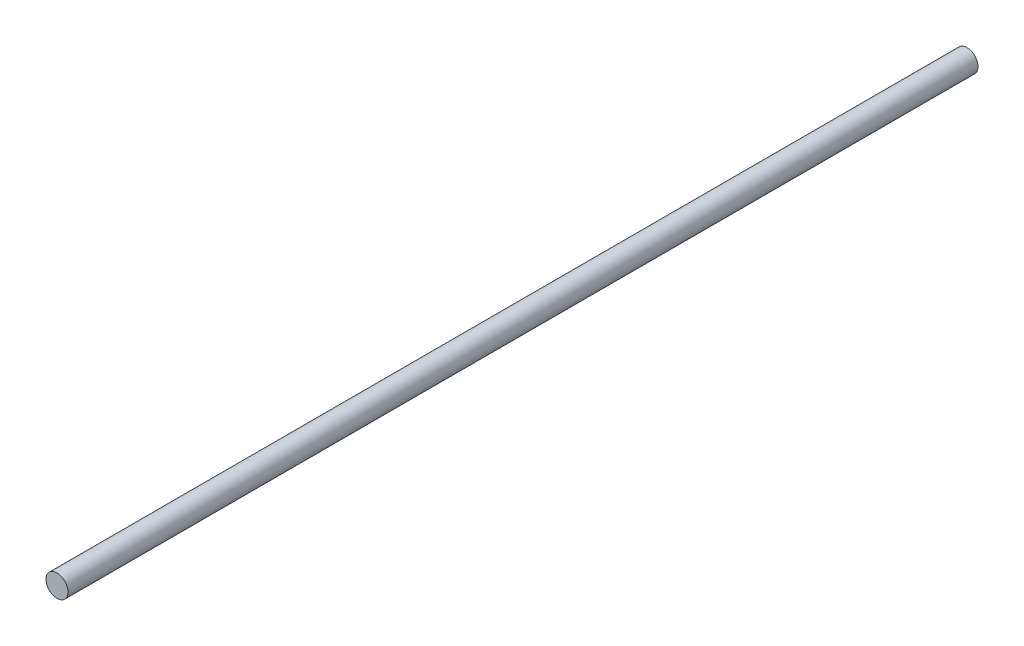
ISO-10303-21;
HEADER;
FILE_DESCRIPTION(('STEP AP214'),'2;1');
FILE_NAME('part.step','',(''),(''),'','','');
FILE_SCHEMA(('AUTOMOTIVE_DESIGN { 1 0 10303 214 1 1 1 1 }'));
ENDSEC;
DATA;
#1=APPLICATION_CONTEXT('core data for automotive mechanical design processes');
#2=APPLICATION_PROTOCOL_DEFINITION('international standard','automotive_design',2000,#1);
#3=PRODUCT_CONTEXT('',#1,'mechanical');
#4=PRODUCT('Part','Part','',(#3));
#5=PRODUCT_RELATED_PRODUCT_CATEGORY('part','',(#4));
#6=PRODUCT_DEFINITION_FORMATION('','',#4);
#7=PRODUCT_DEFINITION_CONTEXT('part definition',#1,'design');
#8=PRODUCT_DEFINITION('design','',#6,#7);
#9=PRODUCT_DEFINITION_SHAPE('','',#8);
#10=(LENGTH_UNIT() NAMED_UNIT(*) SI_UNIT(.MILLI.,.METRE.));
#11=(NAMED_UNIT(*) PLANE_ANGLE_UNIT() SI_UNIT($,.RADIAN.));
#12=(NAMED_UNIT(*) SI_UNIT($,.STERADIAN.) SOLID_ANGLE_UNIT());
#13=UNCERTAINTY_MEASURE_WITH_UNIT(LENGTH_MEASURE(1.E-05),#10,'distance_accuracy_value','');
#14=(GEOMETRIC_REPRESENTATION_CONTEXT(3) GLOBAL_UNCERTAINTY_ASSIGNED_CONTEXT((#13)) GLOBAL_UNIT_ASSIGNED_CONTEXT((#10,
#11,#12)) REPRESENTATION_CONTEXT('',''));
#15=CARTESIAN_POINT('',(0.,0.,0.));
#16=DIRECTION('',(0.,0.,1.));
#17=DIRECTION('',(1.,0.,0.));
#18=AXIS2_PLACEMENT_3D('',#15,#16,#17);
#19=CARTESIAN_POINT('',(0.,0.,330.));
#20=DIRECTION('',(0.,0.,-1.));
#21=DIRECTION('',(-1.,0.,0.));
#22=AXIS2_PLACEMENT_3D('',#19,#20,#21);
#23=CYLINDRICAL_SURFACE('',#22,4.);
#24=CARTESIAN_POINT('',(0.,0.,330.));
#25=DIRECTION('',(0.,0.,1.));
#26=DIRECTION('',(1.,0.,0.));
#27=AXIS2_PLACEMENT_3D('',#24,#25,#26);
#28=CIRCLE('',#27,4.);
#29=CARTESIAN_POINT('',(4.,0.,330.));
#30=VERTEX_POINT('',#29);
#31=EDGE_CURVE('E10',#30,#30,#28,.T.);
#32=ORIENTED_EDGE('',*,*,#31,.F.);
#33=EDGE_LOOP('',(#32));
#34=FACE_BOUND('',#33,.T.);
#35=CARTESIAN_POINT('',(0.,0.,0.));
#36=DIRECTION('',(0.,0.,1.));
#37=DIRECTION('',(1.,0.,0.));
#38=AXIS2_PLACEMENT_3D('',#35,#36,#37);
#39=CIRCLE('',#38,4.);
#40=CARTESIAN_POINT('',(4.,0.,0.));
#41=VERTEX_POINT('',#40);
#42=EDGE_CURVE('E32',#41,#41,#39,.T.);
#43=ORIENTED_EDGE('',*,*,#42,.T.);
#44=EDGE_LOOP('',(#43));
#45=FACE_BOUND('',#44,.T.);
#46=ADVANCED_FACE('F29',(#34,#45),#23,.T.);
#47=CARTESIAN_POINT('',(0.,0.,330.));
#48=DIRECTION('',(0.,0.,1.));
#49=DIRECTION('',(1.,0.,0.));
#50=AXIS2_PLACEMENT_3D('',#47,#48,#49);
#51=PLANE('',#50);
#52=ORIENTED_EDGE('',*,*,#31,.T.);
#53=EDGE_LOOP('',(#52));
#54=FACE_BOUND('',#53,.T.);
#55=ADVANCED_FACE('F44',(#54),#51,.T.);
#56=CARTESIAN_POINT('',(0.,0.,0.));
#57=DIRECTION('',(0.,0.,1.));
#58=DIRECTION('',(1.,0.,0.));
#59=AXIS2_PLACEMENT_3D('',#56,#57,#58);
#60=PLANE('',#59);
#61=ORIENTED_EDGE('',*,*,#42,.F.);
#62=EDGE_LOOP('',(#61));
#63=FACE_BOUND('',#62,.T.);
#64=ADVANCED_FACE('F42',(#63),#60,.F.);
#65=CLOSED_SHELL('',(#46,#55,#64));
#66=MANIFOLD_SOLID_BREP('B2',#65);
#67=ADVANCED_BREP_SHAPE_REPRESENTATION('',(#18,#66),#14);
#68=SHAPE_DEFINITION_REPRESENTATION(#9,#67);
ENDSEC;
END-ISO-10303-21;
